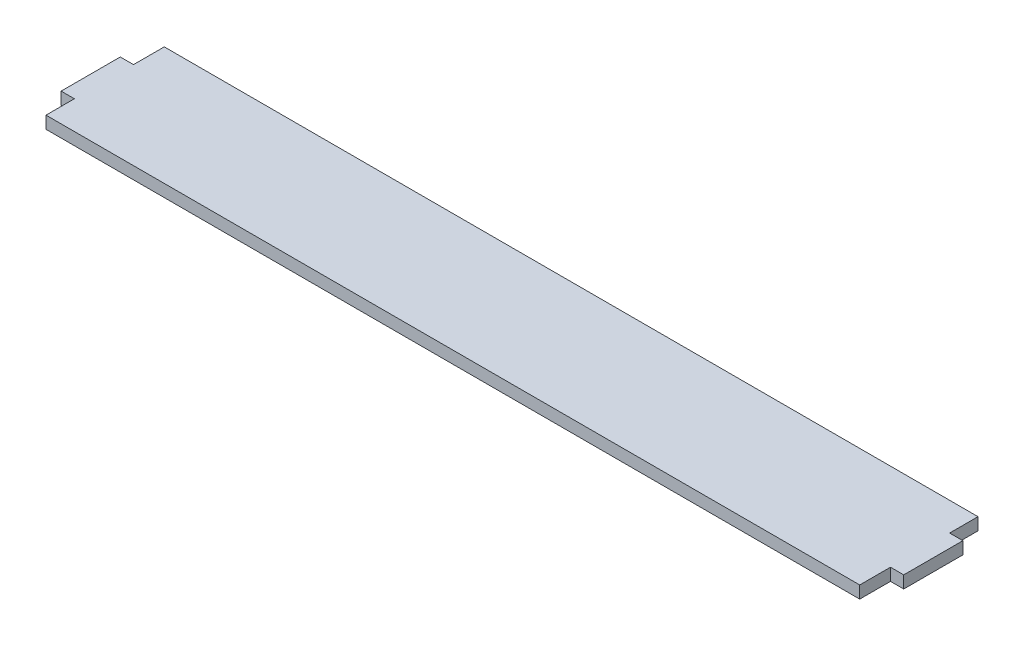
ISO-10303-21;
HEADER;
FILE_DESCRIPTION(('STEP AP214'),'2;1');
FILE_NAME('part.step','',(''),(''),'','','');
FILE_SCHEMA(('AUTOMOTIVE_DESIGN { 1 0 10303 214 1 1 1 1 }'));
ENDSEC;
DATA;
#1=APPLICATION_CONTEXT('core data for automotive mechanical design processes');
#2=APPLICATION_PROTOCOL_DEFINITION('international standard','automotive_design',2000,#1);
#3=PRODUCT_CONTEXT('',#1,'mechanical');
#4=PRODUCT('Part','Part','',(#3));
#5=PRODUCT_RELATED_PRODUCT_CATEGORY('part','',(#4));
#6=PRODUCT_DEFINITION_FORMATION('','',#4);
#7=PRODUCT_DEFINITION_CONTEXT('part definition',#1,'design');
#8=PRODUCT_DEFINITION('design','',#6,#7);
#9=PRODUCT_DEFINITION_SHAPE('','',#8);
#10=(LENGTH_UNIT() NAMED_UNIT(*) SI_UNIT(.MILLI.,.METRE.));
#11=(NAMED_UNIT(*) PLANE_ANGLE_UNIT() SI_UNIT($,.RADIAN.));
#12=(NAMED_UNIT(*) SI_UNIT($,.STERADIAN.) SOLID_ANGLE_UNIT());
#13=UNCERTAINTY_MEASURE_WITH_UNIT(LENGTH_MEASURE(1.E-05),#10,'distance_accuracy_value','');
#14=(GEOMETRIC_REPRESENTATION_CONTEXT(3) GLOBAL_UNCERTAINTY_ASSIGNED_CONTEXT((#13)) GLOBAL_UNIT_ASSIGNED_CONTEXT((#10,
#11,#12)) REPRESENTATION_CONTEXT('',''));
#15=CARTESIAN_POINT('',(0.,0.,0.));
#16=DIRECTION('',(0.,0.,1.));
#17=DIRECTION('',(1.,0.,0.));
#18=AXIS2_PLACEMENT_3D('',#15,#16,#17);
#19=CARTESIAN_POINT('',(43.,1.3,-6.25));
#20=DIRECTION('',(-1.,0.,0.));
#21=DIRECTION('',(0.,0.,1.));
#22=AXIS2_PLACEMENT_3D('',#19,#20,#21);
#23=PLANE('',#22);
#24=DIRECTION('',(0.,-1.,0.));
#25=VECTOR('',#24,1.);
#26=CARTESIAN_POINT('',(43.,1.3,3.));
#27=LINE('',#26,#25);
#28=CARTESIAN_POINT('',(43.,1.3,3.));
#29=VERTEX_POINT('',#28);
#30=CARTESIAN_POINT('',(43.,0.,3.));
#31=VERTEX_POINT('',#30);
#32=EDGE_CURVE('E248',#29,#31,#27,.T.);
#33=ORIENTED_EDGE('',*,*,#32,.F.);
#34=DIRECTION('',(0.,0.,-1.));
#35=VECTOR('',#34,1.);
#36=CARTESIAN_POINT('',(43.,1.3,-6.25));
#37=LINE('',#36,#35);
#38=CARTESIAN_POINT('',(43.,1.3,6.25));
#39=VERTEX_POINT('',#38);
#40=EDGE_CURVE('E185',#39,#29,#37,.T.);
#41=ORIENTED_EDGE('',*,*,#40,.F.);
#42=DIRECTION('',(0.,-1.,0.));
#43=VECTOR('',#42,1.);
#44=CARTESIAN_POINT('',(43.,1.3,6.25));
#45=LINE('',#44,#43);
#46=CARTESIAN_POINT('',(43.,0.,6.25));
#47=VERTEX_POINT('',#46);
#48=EDGE_CURVE('E197',#39,#47,#45,.T.);
#49=ORIENTED_EDGE('',*,*,#48,.T.);
#50=DIRECTION('',(0.,0.,-1.));
#51=VECTOR('',#50,1.);
#52=CARTESIAN_POINT('',(43.,0.,-6.25));
#53=LINE('',#52,#51);
#54=EDGE_CURVE('E198',#47,#31,#53,.T.);
#55=ORIENTED_EDGE('',*,*,#54,.T.);
#56=EDGE_LOOP('',(#33,#41,#49,#55));
#57=FACE_BOUND('',#56,.T.);
#58=ADVANCED_FACE('F42',(#57),#23,.F.);
#59=CARTESIAN_POINT('',(-43.,1.3,-6.25));
#60=DIRECTION('',(1.,0.,0.));
#61=DIRECTION('',(0.,0.,-1.));
#62=AXIS2_PLACEMENT_3D('',#59,#60,#61);
#63=PLANE('',#62);
#64=DIRECTION('',(0.,-1.,0.));
#65=VECTOR('',#64,1.);
#66=CARTESIAN_POINT('',(-43.,1.3,-3.));
#67=LINE('',#66,#65);
#68=CARTESIAN_POINT('',(-43.,1.3,-3.));
#69=VERTEX_POINT('',#68);
#70=CARTESIAN_POINT('',(-43.,0.,-3.));
#71=VERTEX_POINT('',#70);
#72=EDGE_CURVE('E182',#69,#71,#67,.T.);
#73=ORIENTED_EDGE('',*,*,#72,.F.);
#74=DIRECTION('',(0.,0.,1.));
#75=VECTOR('',#74,1.);
#76=CARTESIAN_POINT('',(-43.,1.3,-6.25));
#77=LINE('',#76,#75);
#78=CARTESIAN_POINT('',(-43.,1.3,-6.25));
#79=VERTEX_POINT('',#78);
#80=EDGE_CURVE('E192',#79,#69,#77,.T.);
#81=ORIENTED_EDGE('',*,*,#80,.F.);
#82=DIRECTION('',(0.,-1.,0.));
#83=VECTOR('',#82,1.);
#84=CARTESIAN_POINT('',(-43.,1.3,-6.25));
#85=LINE('',#84,#83);
#86=CARTESIAN_POINT('',(-43.,0.,-6.25));
#87=VERTEX_POINT('',#86);
#88=EDGE_CURVE('E50',#79,#87,#85,.T.);
#89=ORIENTED_EDGE('',*,*,#88,.T.);
#90=DIRECTION('',(0.,0.,1.));
#91=VECTOR('',#90,1.);
#92=CARTESIAN_POINT('',(-43.,0.,-6.25));
#93=LINE('',#92,#91);
#94=EDGE_CURVE('E204',#87,#71,#93,.T.);
#95=ORIENTED_EDGE('',*,*,#94,.T.);
#96=EDGE_LOOP('',(#73,#81,#89,#95));
#97=FACE_BOUND('',#96,.T.);
#98=ADVANCED_FACE('F219',(#97),#63,.F.);
#99=CARTESIAN_POINT('',(43.,1.3,-3.25));
#100=VERTEX_POINT('',#99);
#101=CARTESIAN_POINT('',(43.,1.3,-6.25));
#102=VERTEX_POINT('',#101);
#103=EDGE_CURVE('E189',#100,#102,#37,.T.);
#104=ORIENTED_EDGE('',*,*,#103,.F.);
#105=DIRECTION('',(0.,-1.,0.));
#106=VECTOR('',#105,1.);
#107=CARTESIAN_POINT('',(43.,1.3,-3.25));
#108=LINE('',#107,#106);
#109=CARTESIAN_POINT('',(43.,0.,-3.25));
#110=VERTEX_POINT('',#109);
#111=EDGE_CURVE('E148',#100,#110,#108,.T.);
#112=ORIENTED_EDGE('',*,*,#111,.T.);
#113=CARTESIAN_POINT('',(43.,0.,-6.25));
#114=VERTEX_POINT('',#113);
#115=EDGE_CURVE('E154',#110,#114,#53,.T.);
#116=ORIENTED_EDGE('',*,*,#115,.T.);
#117=DIRECTION('',(0.,-1.,0.));
#118=VECTOR('',#117,1.);
#119=CARTESIAN_POINT('',(43.,1.3,-6.25));
#120=LINE('',#119,#118);
#121=EDGE_CURVE('E11',#102,#114,#120,.T.);
#122=ORIENTED_EDGE('',*,*,#121,.F.);
#123=EDGE_LOOP('',(#104,#112,#116,#122));
#124=FACE_BOUND('',#123,.T.);
#125=ADVANCED_FACE('F44',(#124),#23,.F.);
#126=CARTESIAN_POINT('',(-43.,1.3,-6.25));
#127=DIRECTION('',(0.,0.,1.));
#128=DIRECTION('',(1.,0.,0.));
#129=AXIS2_PLACEMENT_3D('',#126,#127,#128);
#130=PLANE('',#129);
#131=DIRECTION('',(-1.,0.,0.));
#132=VECTOR('',#131,1.);
#133=CARTESIAN_POINT('',(-43.,0.,-6.25));
#134=LINE('',#133,#132);
#135=EDGE_CURVE('E201',#114,#87,#134,.T.);
#136=ORIENTED_EDGE('',*,*,#135,.T.);
#137=ORIENTED_EDGE('',*,*,#88,.F.);
#138=DIRECTION('',(-1.,0.,0.));
#139=VECTOR('',#138,1.);
#140=CARTESIAN_POINT('',(-43.,1.3,-6.25));
#141=LINE('',#140,#139);
#142=EDGE_CURVE('E188',#102,#79,#141,.T.);
#143=ORIENTED_EDGE('',*,*,#142,.F.);
#144=ORIENTED_EDGE('',*,*,#121,.T.);
#145=EDGE_LOOP('',(#136,#137,#143,#144));
#146=FACE_BOUND('',#145,.T.);
#147=ADVANCED_FACE('F230',(#146),#130,.F.);
#148=CARTESIAN_POINT('',(-43.,1.3,3.25));
#149=VERTEX_POINT('',#148);
#150=CARTESIAN_POINT('',(-43.,1.3,6.25));
#151=VERTEX_POINT('',#150);
#152=EDGE_CURVE('E191',#149,#151,#77,.T.);
#153=ORIENTED_EDGE('',*,*,#152,.F.);
#154=DIRECTION('',(0.,-1.,0.));
#155=VECTOR('',#154,1.);
#156=CARTESIAN_POINT('',(-43.,1.3,3.25));
#157=LINE('',#156,#155);
#158=CARTESIAN_POINT('',(-43.,0.,3.25));
#159=VERTEX_POINT('',#158);
#160=EDGE_CURVE('E171',#149,#159,#157,.T.);
#161=ORIENTED_EDGE('',*,*,#160,.T.);
#162=CARTESIAN_POINT('',(-43.,0.,6.25));
#163=VERTEX_POINT('',#162);
#164=EDGE_CURVE('E203',#159,#163,#93,.T.);
#165=ORIENTED_EDGE('',*,*,#164,.T.);
#166=DIRECTION('',(0.,-1.,0.));
#167=VECTOR('',#166,1.);
#168=CARTESIAN_POINT('',(-43.,1.3,6.25));
#169=LINE('',#168,#167);
#170=EDGE_CURVE('E211',#151,#163,#169,.T.);
#171=ORIENTED_EDGE('',*,*,#170,.F.);
#172=EDGE_LOOP('',(#153,#161,#165,#171));
#173=FACE_BOUND('',#172,.T.);
#174=ADVANCED_FACE('F238',(#173),#63,.F.);
#175=CARTESIAN_POINT('',(-43.,1.3,6.25));
#176=DIRECTION('',(0.,0.,-1.));
#177=DIRECTION('',(-1.,0.,0.));
#178=AXIS2_PLACEMENT_3D('',#175,#176,#177);
#179=PLANE('',#178);
#180=DIRECTION('',(1.,0.,0.));
#181=VECTOR('',#180,1.);
#182=CARTESIAN_POINT('',(-43.,0.,6.25));
#183=LINE('',#182,#181);
#184=EDGE_CURVE('E207',#163,#47,#183,.T.);
#185=ORIENTED_EDGE('',*,*,#184,.T.);
#186=ORIENTED_EDGE('',*,*,#48,.F.);
#187=DIRECTION('',(1.,0.,0.));
#188=VECTOR('',#187,1.);
#189=CARTESIAN_POINT('',(-43.,1.3,6.25));
#190=LINE('',#189,#188);
#191=EDGE_CURVE('E195',#151,#39,#190,.T.);
#192=ORIENTED_EDGE('',*,*,#191,.F.);
#193=ORIENTED_EDGE('',*,*,#170,.T.);
#194=EDGE_LOOP('',(#185,#186,#192,#193));
#195=FACE_BOUND('',#194,.T.);
#196=ADVANCED_FACE('F256',(#195),#179,.F.);
#197=CARTESIAN_POINT('',(0.,1.3,0.));
#198=DIRECTION('',(0.,1.,0.));
#199=DIRECTION('',(0.,0.,1.));
#200=AXIS2_PLACEMENT_3D('',#197,#198,#199);
#201=PLANE('',#200);
#202=ORIENTED_EDGE('',*,*,#40,.T.);
#203=DIRECTION('',(1.,0.,0.));
#204=VECTOR('',#203,1.);
#205=CARTESIAN_POINT('',(43.,1.3,3.));
#206=LINE('',#205,#204);
#207=CARTESIAN_POINT('',(44.4,1.3,3.));
#208=VERTEX_POINT('',#207);
#209=EDGE_CURVE('E155',#29,#208,#206,.T.);
#210=ORIENTED_EDGE('',*,*,#209,.T.);
#211=DIRECTION('',(0.,0.,-1.));
#212=VECTOR('',#211,1.);
#213=CARTESIAN_POINT('',(44.4,1.3,-3.25));
#214=LINE('',#213,#212);
#215=CARTESIAN_POINT('',(44.4,1.3,-3.25));
#216=VERTEX_POINT('',#215);
#217=EDGE_CURVE('E157',#208,#216,#214,.T.);
#218=ORIENTED_EDGE('',*,*,#217,.T.);
#219=DIRECTION('',(-1.,0.,0.));
#220=VECTOR('',#219,1.);
#221=CARTESIAN_POINT('',(43.,1.3,-3.25));
#222=LINE('',#221,#220);
#223=EDGE_CURVE('E147',#216,#100,#222,.T.);
#224=ORIENTED_EDGE('',*,*,#223,.T.);
#225=ORIENTED_EDGE('',*,*,#103,.T.);
#226=ORIENTED_EDGE('',*,*,#142,.T.);
#227=ORIENTED_EDGE('',*,*,#80,.T.);
#228=DIRECTION('',(-1.,0.,0.));
#229=VECTOR('',#228,1.);
#230=CARTESIAN_POINT('',(-43.,1.3,-3.));
#231=LINE('',#230,#229);
#232=CARTESIAN_POINT('',(-44.4,1.3,-3.));
#233=VERTEX_POINT('',#232);
#234=EDGE_CURVE('E165',#69,#233,#231,.T.);
#235=ORIENTED_EDGE('',*,*,#234,.T.);
#236=DIRECTION('',(0.,0.,1.));
#237=VECTOR('',#236,1.);
#238=CARTESIAN_POINT('',(-44.4,1.3,-3.));
#239=LINE('',#238,#237);
#240=CARTESIAN_POINT('',(-44.4,1.3,3.25));
#241=VERTEX_POINT('',#240);
#242=EDGE_CURVE('E167',#233,#241,#239,.T.);
#243=ORIENTED_EDGE('',*,*,#242,.T.);
#244=DIRECTION('',(1.,0.,0.));
#245=VECTOR('',#244,1.);
#246=CARTESIAN_POINT('',(-43.,1.3,3.25));
#247=LINE('',#246,#245);
#248=EDGE_CURVE('E169',#241,#149,#247,.T.);
#249=ORIENTED_EDGE('',*,*,#248,.T.);
#250=ORIENTED_EDGE('',*,*,#152,.T.);
#251=ORIENTED_EDGE('',*,*,#191,.T.);
#252=EDGE_LOOP('',(#202,#210,#218,#224,#225,#226,#227,#235,#243,#249,#250,#251));
#253=FACE_BOUND('',#252,.T.);
#254=ADVANCED_FACE('F227',(#253),#201,.T.);
#255=CARTESIAN_POINT('',(0.,0.,0.));
#256=DIRECTION('',(0.,1.,0.));
#257=DIRECTION('',(0.,0.,1.));
#258=AXIS2_PLACEMENT_3D('',#255,#256,#257);
#259=PLANE('',#258);
#260=ORIENTED_EDGE('',*,*,#54,.F.);
#261=ORIENTED_EDGE('',*,*,#184,.F.);
#262=ORIENTED_EDGE('',*,*,#164,.F.);
#263=DIRECTION('',(1.,0.,0.));
#264=VECTOR('',#263,1.);
#265=CARTESIAN_POINT('',(-43.,0.,3.25));
#266=LINE('',#265,#264);
#267=CARTESIAN_POINT('',(-44.4,0.,3.25));
#268=VERTEX_POINT('',#267);
#269=EDGE_CURVE('E65',#268,#159,#266,.T.);
#270=ORIENTED_EDGE('',*,*,#269,.F.);
#271=DIRECTION('',(0.,0.,1.));
#272=VECTOR('',#271,1.);
#273=CARTESIAN_POINT('',(-44.4,0.,-3.));
#274=LINE('',#273,#272);
#275=CARTESIAN_POINT('',(-44.4,0.,-3.));
#276=VERTEX_POINT('',#275);
#277=EDGE_CURVE('E173',#276,#268,#274,.T.);
#278=ORIENTED_EDGE('',*,*,#277,.F.);
#279=DIRECTION('',(-1.,0.,0.));
#280=VECTOR('',#279,1.);
#281=CARTESIAN_POINT('',(-43.,0.,-3.));
#282=LINE('',#281,#280);
#283=EDGE_CURVE('E162',#71,#276,#282,.T.);
#284=ORIENTED_EDGE('',*,*,#283,.F.);
#285=ORIENTED_EDGE('',*,*,#94,.F.);
#286=ORIENTED_EDGE('',*,*,#135,.F.);
#287=ORIENTED_EDGE('',*,*,#115,.F.);
#288=DIRECTION('',(-1.,0.,0.));
#289=VECTOR('',#288,1.);
#290=CARTESIAN_POINT('',(43.,0.,-3.25));
#291=LINE('',#290,#289);
#292=CARTESIAN_POINT('',(44.4,0.,-3.25));
#293=VERTEX_POINT('',#292);
#294=EDGE_CURVE('E57',#293,#110,#291,.T.);
#295=ORIENTED_EDGE('',*,*,#294,.F.);
#296=DIRECTION('',(0.,0.,-1.));
#297=VECTOR('',#296,1.);
#298=CARTESIAN_POINT('',(44.4,0.,-3.25));
#299=LINE('',#298,#297);
#300=CARTESIAN_POINT('',(44.4,0.,3.));
#301=VERTEX_POINT('',#300);
#302=EDGE_CURVE('E136',#301,#293,#299,.T.);
#303=ORIENTED_EDGE('',*,*,#302,.F.);
#304=DIRECTION('',(1.,0.,0.));
#305=VECTOR('',#304,1.);
#306=CARTESIAN_POINT('',(43.,0.,3.));
#307=LINE('',#306,#305);
#308=EDGE_CURVE('E144',#31,#301,#307,.T.);
#309=ORIENTED_EDGE('',*,*,#308,.F.);
#310=EDGE_LOOP('',(#260,#261,#262,#270,#278,#284,#285,#286,#287,#295,#303,#309));
#311=FACE_BOUND('',#310,.T.);
#312=ADVANCED_FACE('F152',(#311),#259,.F.);
#313=CARTESIAN_POINT('',(-43.,1.3,-3.));
#314=DIRECTION('',(0.,0.,1.));
#315=DIRECTION('',(1.,0.,0.));
#316=AXIS2_PLACEMENT_3D('',#313,#314,#315);
#317=PLANE('',#316);
#318=ORIENTED_EDGE('',*,*,#283,.T.);
#319=DIRECTION('',(0.,-1.,0.));
#320=VECTOR('',#319,1.);
#321=CARTESIAN_POINT('',(-44.4,1.3,-3.));
#322=LINE('',#321,#320);
#323=EDGE_CURVE('E179',#233,#276,#322,.T.);
#324=ORIENTED_EDGE('',*,*,#323,.F.);
#325=ORIENTED_EDGE('',*,*,#234,.F.);
#326=ORIENTED_EDGE('',*,*,#72,.T.);
#327=EDGE_LOOP('',(#318,#324,#325,#326));
#328=FACE_BOUND('',#327,.T.);
#329=ADVANCED_FACE('F225',(#328),#317,.F.);
#330=CARTESIAN_POINT('',(-44.4,1.3,-3.));
#331=DIRECTION('',(1.,0.,0.));
#332=DIRECTION('',(0.,0.,-1.));
#333=AXIS2_PLACEMENT_3D('',#330,#331,#332);
#334=PLANE('',#333);
#335=ORIENTED_EDGE('',*,*,#277,.T.);
#336=DIRECTION('',(0.,-1.,0.));
#337=VECTOR('',#336,1.);
#338=CARTESIAN_POINT('',(-44.4,1.3,3.25));
#339=LINE('',#338,#337);
#340=EDGE_CURVE('E177',#241,#268,#339,.T.);
#341=ORIENTED_EDGE('',*,*,#340,.F.);
#342=ORIENTED_EDGE('',*,*,#242,.F.);
#343=ORIENTED_EDGE('',*,*,#323,.T.);
#344=EDGE_LOOP('',(#335,#341,#342,#343));
#345=FACE_BOUND('',#344,.T.);
#346=ADVANCED_FACE('F269',(#345),#334,.F.);
#347=CARTESIAN_POINT('',(-43.,1.3,3.25));
#348=DIRECTION('',(0.,0.,-1.));
#349=DIRECTION('',(-1.,0.,0.));
#350=AXIS2_PLACEMENT_3D('',#347,#348,#349);
#351=PLANE('',#350);
#352=ORIENTED_EDGE('',*,*,#269,.T.);
#353=ORIENTED_EDGE('',*,*,#160,.F.);
#354=ORIENTED_EDGE('',*,*,#248,.F.);
#355=ORIENTED_EDGE('',*,*,#340,.T.);
#356=EDGE_LOOP('',(#352,#353,#354,#355));
#357=FACE_BOUND('',#356,.T.);
#358=ADVANCED_FACE('F262',(#357),#351,.F.);
#359=CARTESIAN_POINT('',(43.,1.3,3.));
#360=DIRECTION('',(0.,0.,-1.));
#361=DIRECTION('',(-1.,0.,0.));
#362=AXIS2_PLACEMENT_3D('',#359,#360,#361);
#363=PLANE('',#362);
#364=ORIENTED_EDGE('',*,*,#308,.T.);
#365=DIRECTION('',(0.,-1.,0.));
#366=VECTOR('',#365,1.);
#367=CARTESIAN_POINT('',(44.4,1.3,3.));
#368=LINE('',#367,#366);
#369=EDGE_CURVE('E142',#208,#301,#368,.T.);
#370=ORIENTED_EDGE('',*,*,#369,.F.);
#371=ORIENTED_EDGE('',*,*,#209,.F.);
#372=ORIENTED_EDGE('',*,*,#32,.T.);
#373=EDGE_LOOP('',(#364,#370,#371,#372));
#374=FACE_BOUND('',#373,.T.);
#375=ADVANCED_FACE('F259',(#374),#363,.F.);
#376=CARTESIAN_POINT('',(44.4,1.3,-3.25));
#377=DIRECTION('',(-1.,0.,0.));
#378=DIRECTION('',(0.,0.,1.));
#379=AXIS2_PLACEMENT_3D('',#376,#377,#378);
#380=PLANE('',#379);
#381=ORIENTED_EDGE('',*,*,#302,.T.);
#382=DIRECTION('',(0.,-1.,0.));
#383=VECTOR('',#382,1.);
#384=CARTESIAN_POINT('',(44.4,1.3,-3.25));
#385=LINE('',#384,#383);
#386=EDGE_CURVE('E139',#216,#293,#385,.T.);
#387=ORIENTED_EDGE('',*,*,#386,.F.);
#388=ORIENTED_EDGE('',*,*,#217,.F.);
#389=ORIENTED_EDGE('',*,*,#369,.T.);
#390=EDGE_LOOP('',(#381,#387,#388,#389));
#391=FACE_BOUND('',#390,.T.);
#392=ADVANCED_FACE('F137',(#391),#380,.F.);
#393=CARTESIAN_POINT('',(43.,1.3,-3.25));
#394=DIRECTION('',(0.,0.,1.));
#395=DIRECTION('',(1.,0.,0.));
#396=AXIS2_PLACEMENT_3D('',#393,#394,#395);
#397=PLANE('',#396);
#398=ORIENTED_EDGE('',*,*,#294,.T.);
#399=ORIENTED_EDGE('',*,*,#111,.F.);
#400=ORIENTED_EDGE('',*,*,#223,.F.);
#401=ORIENTED_EDGE('',*,*,#386,.T.);
#402=EDGE_LOOP('',(#398,#399,#400,#401));
#403=FACE_BOUND('',#402,.T.);
#404=ADVANCED_FACE('F146',(#403),#397,.F.);
#405=CLOSED_SHELL('',(#58,#98,#125,#147,#174,#196,#254,#312,#329,#346,#358,#375,#392,#404));
#406=MANIFOLD_SOLID_BREP('B2',#405);
#407=ADVANCED_BREP_SHAPE_REPRESENTATION('',(#18,#406),#14);
#408=SHAPE_DEFINITION_REPRESENTATION(#9,#407);
ENDSEC;
END-ISO-10303-21;
